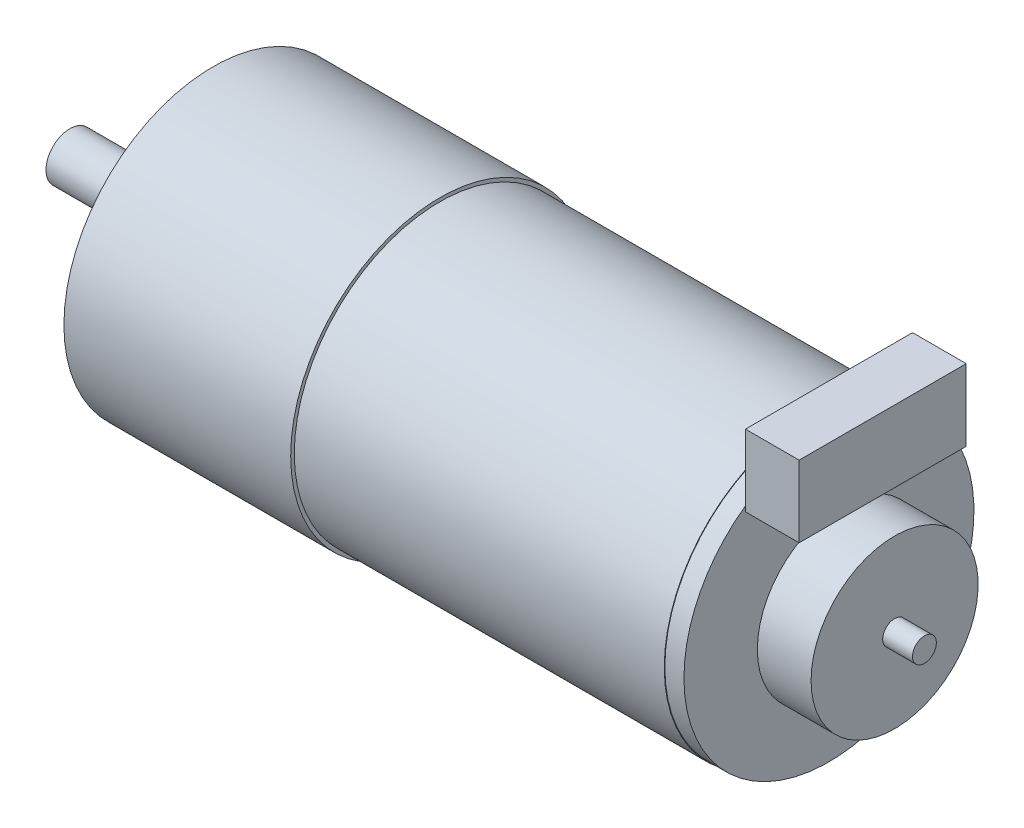
ISO-10303-21;
HEADER;
FILE_DESCRIPTION(('STEP AP214'),'2;1');
FILE_NAME('part.step','',(''),(''),'','','');
FILE_SCHEMA(('AUTOMOTIVE_DESIGN { 1 0 10303 214 1 1 1 1 }'));
ENDSEC;
DATA;
#1=APPLICATION_CONTEXT('core data for automotive mechanical design processes');
#2=APPLICATION_PROTOCOL_DEFINITION('international standard','automotive_design',2000,#1);
#3=PRODUCT_CONTEXT('',#1,'mechanical');
#4=PRODUCT('Part','Part','',(#3));
#5=PRODUCT_RELATED_PRODUCT_CATEGORY('part','',(#4));
#6=PRODUCT_DEFINITION_FORMATION('','',#4);
#7=PRODUCT_DEFINITION_CONTEXT('part definition',#1,'design');
#8=PRODUCT_DEFINITION('design','',#6,#7);
#9=PRODUCT_DEFINITION_SHAPE('','',#8);
#10=(LENGTH_UNIT() NAMED_UNIT(*) SI_UNIT(.MILLI.,.METRE.));
#11=(NAMED_UNIT(*) PLANE_ANGLE_UNIT() SI_UNIT($,.RADIAN.));
#12=(NAMED_UNIT(*) SI_UNIT($,.STERADIAN.) SOLID_ANGLE_UNIT());
#13=UNCERTAINTY_MEASURE_WITH_UNIT(LENGTH_MEASURE(1.E-05),#10,'distance_accuracy_value','');
#14=(GEOMETRIC_REPRESENTATION_CONTEXT(3) GLOBAL_UNCERTAINTY_ASSIGNED_CONTEXT((#13)) GLOBAL_UNIT_ASSIGNED_CONTEXT((#10,
#11,#12)) REPRESENTATION_CONTEXT('',''));
#15=CARTESIAN_POINT('',(0.,0.,0.));
#16=DIRECTION('',(0.,0.,1.));
#17=DIRECTION('',(1.,0.,0.));
#18=AXIS2_PLACEMENT_3D('',#15,#16,#17);
#19=CARTESIAN_POINT('',(32.6,0.,0.));
#20=DIRECTION('',(-1.,0.,0.));
#21=DIRECTION('',(0.,0.,1.));
#22=AXIS2_PLACEMENT_3D('',#19,#20,#21);
#23=PLANE('',#22);
#24=CARTESIAN_POINT('',(32.6,0.,0.));
#25=DIRECTION('',(-1.,0.,0.));
#26=DIRECTION('',(0.,0.,1.));
#27=AXIS2_PLACEMENT_3D('',#24,#25,#26);
#28=CIRCLE('',#27,1.);
#29=CARTESIAN_POINT('',(32.6,0.,1.));
#30=VERTEX_POINT('',#29);
#31=EDGE_CURVE('E135',#30,#30,#28,.T.);
#32=ORIENTED_EDGE('',*,*,#31,.T.);
#33=EDGE_LOOP('',(#32));
#34=FACE_BOUND('',#33,.T.);
#35=DIRECTION('',(0.,1.,0.));
#36=VECTOR('',#35,1.);
#37=CARTESIAN_POINT('',(32.6,9.5,-7.));
#38=LINE('',#37,#36);
#39=CARTESIAN_POINT('',(32.6,9.5,-7.));
#40=VERTEX_POINT('',#39);
#41=CARTESIAN_POINT('',(32.6,9.93088616388286,-7.));
#42=VERTEX_POINT('',#41);
#43=EDGE_CURVE('E518',#40,#42,#38,.T.);
#44=ORIENTED_EDGE('',*,*,#43,.F.);
#45=DIRECTION('',(0.,0.,-1.));
#46=VECTOR('',#45,1.);
#47=CARTESIAN_POINT('',(32.6,9.5,-7.));
#48=LINE('',#47,#46);
#49=CARTESIAN_POINT('',(32.6,9.5,7.));
#50=VERTEX_POINT('',#49);
#51=EDGE_CURVE('E54',#50,#40,#48,.T.);
#52=ORIENTED_EDGE('',*,*,#51,.F.);
#53=DIRECTION('',(0.,-1.,0.));
#54=VECTOR('',#53,1.);
#55=CARTESIAN_POINT('',(32.6,0.,7.));
#56=LINE('',#55,#54);
#57=CARTESIAN_POINT('',(32.6,9.93088616388286,7.));
#58=VERTEX_POINT('',#57);
#59=EDGE_CURVE('E11',#58,#50,#56,.T.);
#60=ORIENTED_EDGE('',*,*,#59,.F.);
#61=CARTESIAN_POINT('',(32.6,0.,0.));
#62=DIRECTION('',(-1.,0.,0.));
#63=DIRECTION('',(0.,0.,1.));
#64=AXIS2_PLACEMENT_3D('',#61,#62,#63);
#65=CIRCLE('',#64,12.15);
#66=EDGE_CURVE('E58',#42,#58,#65,.T.);
#67=ORIENTED_EDGE('',*,*,#66,.F.);
#68=EDGE_LOOP('',(#44,#52,#60,#67));
#69=FACE_BOUND('',#68,.T.);
#70=ADVANCED_FACE('F39',(#34,#69),#23,.F.);
#71=CARTESIAN_POINT('',(38.1,0.,0.));
#72=DIRECTION('',(-1.,0.,0.));
#73=DIRECTION('',(0.,0.,1.));
#74=AXIS2_PLACEMENT_3D('',#71,#72,#73);
#75=PLANE('',#74);
#76=CARTESIAN_POINT('',(38.1,0.,0.));
#77=DIRECTION('',(-1.,0.,0.));
#78=DIRECTION('',(0.,0.,1.));
#79=AXIS2_PLACEMENT_3D('',#76,#77,#78);
#80=CIRCLE('',#79,7.);
#81=CARTESIAN_POINT('',(38.1,0.,7.));
#82=VERTEX_POINT('',#81);
#83=EDGE_CURVE('E121',#82,#82,#80,.T.);
#84=ORIENTED_EDGE('',*,*,#83,.F.);
#85=EDGE_LOOP('',(#84));
#86=FACE_BOUND('',#85,.T.);
#87=CARTESIAN_POINT('',(38.1,0.,0.));
#88=DIRECTION('',(-1.,0.,0.));
#89=DIRECTION('',(0.,0.,1.));
#90=AXIS2_PLACEMENT_3D('',#87,#88,#89);
#91=CIRCLE('',#90,1.);
#92=CARTESIAN_POINT('',(38.1,0.,1.));
#93=VERTEX_POINT('',#92);
#94=EDGE_CURVE('E47',#93,#93,#91,.T.);
#95=ORIENTED_EDGE('',*,*,#94,.T.);
#96=EDGE_LOOP('',(#95));
#97=FACE_BOUND('',#96,.T.);
#98=ADVANCED_FACE('F41',(#86,#97),#75,.F.);
#99=CARTESIAN_POINT('',(-48.7692223107347,0.,0.));
#100=DIRECTION('',(-1.,0.,0.));
#101=DIRECTION('',(0.,0.,1.));
#102=AXIS2_PLACEMENT_3D('',#99,#100,#101);
#103=CYLINDRICAL_SURFACE('',#102,1.);
#104=CARTESIAN_POINT('',(40.6,0.,0.));
#105=DIRECTION('',(-1.,0.,0.));
#106=DIRECTION('',(0.,0.,1.));
#107=AXIS2_PLACEMENT_3D('',#104,#105,#106);
#108=CIRCLE('',#107,1.);
#109=CARTESIAN_POINT('',(40.6,0.,1.));
#110=VERTEX_POINT('',#109);
#111=EDGE_CURVE('E167',#110,#110,#108,.T.);
#112=ORIENTED_EDGE('',*,*,#111,.T.);
#113=EDGE_LOOP('',(#112));
#114=FACE_BOUND('',#113,.T.);
#115=ORIENTED_EDGE('',*,*,#94,.F.);
#116=EDGE_LOOP('',(#115));
#117=FACE_BOUND('',#116,.T.);
#118=ADVANCED_FACE('F173',(#114,#117),#103,.T.);
#119=CARTESIAN_POINT('',(40.6,0.,0.));
#120=DIRECTION('',(-1.,0.,0.));
#121=DIRECTION('',(0.,0.,1.));
#122=AXIS2_PLACEMENT_3D('',#119,#120,#121);
#123=PLANE('',#122);
#124=ORIENTED_EDGE('',*,*,#111,.F.);
#125=EDGE_LOOP('',(#124));
#126=FACE_BOUND('',#125,.T.);
#127=ADVANCED_FACE('F175',(#126),#123,.F.);
#128=CARTESIAN_POINT('',(-31.,0.,0.));
#129=DIRECTION('',(-1.,0.,0.));
#130=DIRECTION('',(0.,0.,1.));
#131=AXIS2_PLACEMENT_3D('',#128,#129,#130);
#132=PLANE('',#131);
#133=CARTESIAN_POINT('',(-31.,0.,0.));
#134=DIRECTION('',(-1.,0.,0.));
#135=DIRECTION('',(0.,0.,1.));
#136=AXIS2_PLACEMENT_3D('',#133,#134,#135);
#137=CIRCLE('',#136,2.);
#138=CARTESIAN_POINT('',(-31.,0.,2.));
#139=VERTEX_POINT('',#138);
#140=EDGE_CURVE('E164',#139,#139,#137,.T.);
#141=ORIENTED_EDGE('',*,*,#140,.T.);
#142=EDGE_LOOP('',(#141));
#143=FACE_BOUND('',#142,.T.);
#144=ADVANCED_FACE('F181',(#143),#132,.T.);
#145=CARTESIAN_POINT('',(-48.7692223107347,0.,0.));
#146=DIRECTION('',(-1.,0.,0.));
#147=DIRECTION('',(0.,0.,1.));
#148=AXIS2_PLACEMENT_3D('',#145,#146,#147);
#149=CYLINDRICAL_SURFACE('',#148,2.);
#150=ORIENTED_EDGE('',*,*,#140,.F.);
#151=EDGE_LOOP('',(#150));
#152=FACE_BOUND('',#151,.T.);
#153=CARTESIAN_POINT('',(-21.5,0.,0.));
#154=DIRECTION('',(-1.,0.,0.));
#155=DIRECTION('',(0.,0.,1.));
#156=AXIS2_PLACEMENT_3D('',#153,#154,#155);
#157=CIRCLE('',#156,2.);
#158=CARTESIAN_POINT('',(-21.5,0.,2.));
#159=VERTEX_POINT('',#158);
#160=EDGE_CURVE('E161',#159,#159,#157,.T.);
#161=ORIENTED_EDGE('',*,*,#160,.T.);
#162=EDGE_LOOP('',(#161));
#163=FACE_BOUND('',#162,.T.);
#164=ADVANCED_FACE('F225',(#152,#163),#149,.T.);
#165=CARTESIAN_POINT('',(-21.5,0.,0.));
#166=DIRECTION('',(-1.,0.,0.));
#167=DIRECTION('',(0.,0.,1.));
#168=AXIS2_PLACEMENT_3D('',#165,#166,#167);
#169=PLANE('',#168);
#170=CARTESIAN_POINT('',(-21.5,0.,0.));
#171=DIRECTION('',(-1.,0.,0.));
#172=DIRECTION('',(0.,0.,1.));
#173=AXIS2_PLACEMENT_3D('',#170,#171,#172);
#174=CIRCLE('',#173,3.5);
#175=CARTESIAN_POINT('',(-21.5,0.,3.5));
#176=VERTEX_POINT('',#175);
#177=EDGE_CURVE('E158',#176,#176,#174,.T.);
#178=ORIENTED_EDGE('',*,*,#177,.T.);
#179=EDGE_LOOP('',(#178));
#180=FACE_BOUND('',#179,.T.);
#181=ORIENTED_EDGE('',*,*,#160,.F.);
#182=EDGE_LOOP('',(#181));
#183=FACE_BOUND('',#182,.T.);
#184=ADVANCED_FACE('F221',(#180,#183),#169,.T.);
#185=CARTESIAN_POINT('',(-48.7692223107347,0.,0.));
#186=DIRECTION('',(-1.,0.,0.));
#187=DIRECTION('',(0.,0.,1.));
#188=AXIS2_PLACEMENT_3D('',#185,#186,#187);
#189=CYLINDRICAL_SURFACE('',#188,3.5);
#190=ORIENTED_EDGE('',*,*,#177,.F.);
#191=EDGE_LOOP('',(#190));
#192=FACE_BOUND('',#191,.T.);
#193=CARTESIAN_POINT('',(-19.,0.,0.));
#194=DIRECTION('',(-1.,0.,0.));
#195=DIRECTION('',(0.,0.,1.));
#196=AXIS2_PLACEMENT_3D('',#193,#194,#195);
#197=CIRCLE('',#196,3.5);
#198=CARTESIAN_POINT('',(-19.,0.,3.5));
#199=VERTEX_POINT('',#198);
#200=EDGE_CURVE('E155',#199,#199,#197,.T.);
#201=ORIENTED_EDGE('',*,*,#200,.T.);
#202=EDGE_LOOP('',(#201));
#203=FACE_BOUND('',#202,.T.);
#204=ADVANCED_FACE('F217',(#192,#203),#189,.T.);
#205=CARTESIAN_POINT('',(-19.,0.,0.));
#206=DIRECTION('',(-1.,0.,0.));
#207=DIRECTION('',(0.,0.,1.));
#208=AXIS2_PLACEMENT_3D('',#205,#206,#207);
#209=PLANE('',#208);
#210=CARTESIAN_POINT('',(-19.,8.5,0.));
#211=DIRECTION('',(-1.,0.,0.));
#212=DIRECTION('',(0.,0.,1.));
#213=AXIS2_PLACEMENT_3D('',#210,#211,#212);
#214=CIRCLE('',#213,1.5);
#215=CARTESIAN_POINT('',(-19.,8.5,1.5));
#216=VERTEX_POINT('',#215);
#217=EDGE_CURVE('E122',#216,#216,#214,.T.);
#218=ORIENTED_EDGE('',*,*,#217,.F.);
#219=EDGE_LOOP('',(#218));
#220=FACE_BOUND('',#219,.T.);
#221=CARTESIAN_POINT('',(-19.,-8.5,0.));
#222=DIRECTION('',(-1.,0.,0.));
#223=DIRECTION('',(0.,0.,1.));
#224=AXIS2_PLACEMENT_3D('',#221,#222,#223);
#225=CIRCLE('',#224,1.5);
#226=CARTESIAN_POINT('',(-19.,-8.5,1.5));
#227=VERTEX_POINT('',#226);
#228=EDGE_CURVE('E112',#227,#227,#225,.T.);
#229=ORIENTED_EDGE('',*,*,#228,.F.);
#230=EDGE_LOOP('',(#229));
#231=FACE_BOUND('',#230,.T.);
#232=CARTESIAN_POINT('',(-19.,0.,0.));
#233=DIRECTION('',(-1.,0.,0.));
#234=DIRECTION('',(0.,0.,1.));
#235=AXIS2_PLACEMENT_3D('',#232,#233,#234);
#236=CIRCLE('',#235,12.5);
#237=CARTESIAN_POINT('',(-19.,0.,12.5));
#238=VERTEX_POINT('',#237);
#239=EDGE_CURVE('E152',#238,#238,#236,.T.);
#240=ORIENTED_EDGE('',*,*,#239,.T.);
#241=EDGE_LOOP('',(#240));
#242=FACE_BOUND('',#241,.T.);
#243=ORIENTED_EDGE('',*,*,#200,.F.);
#244=EDGE_LOOP('',(#243));
#245=FACE_BOUND('',#244,.T.);
#246=ADVANCED_FACE('F213',(#220,#231,#242,#245),#209,.T.);
#247=CARTESIAN_POINT('',(-48.7692223107347,0.,0.));
#248=DIRECTION('',(-1.,0.,0.));
#249=DIRECTION('',(0.,0.,1.));
#250=AXIS2_PLACEMENT_3D('',#247,#248,#249);
#251=CYLINDRICAL_SURFACE('',#250,12.5);
#252=ORIENTED_EDGE('',*,*,#239,.F.);
#253=EDGE_LOOP('',(#252));
#254=FACE_BOUND('',#253,.T.);
#255=CARTESIAN_POINT('',(0.,0.,0.));
#256=DIRECTION('',(-1.,0.,0.));
#257=DIRECTION('',(0.,0.,1.));
#258=AXIS2_PLACEMENT_3D('',#255,#256,#257);
#259=CIRCLE('',#258,12.5);
#260=CARTESIAN_POINT('',(0.,0.,12.5));
#261=VERTEX_POINT('',#260);
#262=EDGE_CURVE('E149',#261,#261,#259,.T.);
#263=ORIENTED_EDGE('',*,*,#262,.T.);
#264=EDGE_LOOP('',(#263));
#265=FACE_BOUND('',#264,.T.);
#266=ADVANCED_FACE('F209',(#254,#265),#251,.T.);
#267=CARTESIAN_POINT('',(0.,0.,0.));
#268=DIRECTION('',(-1.,0.,0.));
#269=DIRECTION('',(0.,0.,1.));
#270=AXIS2_PLACEMENT_3D('',#267,#268,#269);
#271=PLANE('',#270);
#272=ORIENTED_EDGE('',*,*,#262,.F.);
#273=EDGE_LOOP('',(#272));
#274=FACE_BOUND('',#273,.T.);
#275=CARTESIAN_POINT('',(0.,0.,0.));
#276=DIRECTION('',(-1.,0.,0.));
#277=DIRECTION('',(0.,0.,1.));
#278=AXIS2_PLACEMENT_3D('',#275,#276,#277);
#279=CIRCLE('',#278,12.2);
#280=CARTESIAN_POINT('',(0.,0.,12.2));
#281=VERTEX_POINT('',#280);
#282=EDGE_CURVE('E146',#281,#281,#279,.T.);
#283=ORIENTED_EDGE('',*,*,#282,.T.);
#284=EDGE_LOOP('',(#283));
#285=FACE_BOUND('',#284,.T.);
#286=ADVANCED_FACE('F205',(#274,#285),#271,.F.);
#287=CARTESIAN_POINT('',(-48.7692223107347,0.,0.));
#288=DIRECTION('',(-1.,0.,0.));
#289=DIRECTION('',(0.,0.,1.));
#290=AXIS2_PLACEMENT_3D('',#287,#288,#289);
#291=CYLINDRICAL_SURFACE('',#290,12.2);
#292=CARTESIAN_POINT('',(31.,0.,0.));
#293=DIRECTION('',(-1.,0.,0.));
#294=DIRECTION('',(0.,0.,1.));
#295=AXIS2_PLACEMENT_3D('',#292,#293,#294);
#296=CIRCLE('',#295,12.2);
#297=CARTESIAN_POINT('',(31.,0.,12.2));
#298=VERTEX_POINT('',#297);
#299=EDGE_CURVE('E143',#298,#298,#296,.T.);
#300=ORIENTED_EDGE('',*,*,#299,.T.);
#301=EDGE_LOOP('',(#300));
#302=FACE_BOUND('',#301,.T.);
#303=ORIENTED_EDGE('',*,*,#282,.F.);
#304=EDGE_LOOP('',(#303));
#305=FACE_BOUND('',#304,.T.);
#306=ADVANCED_FACE('F201',(#302,#305),#291,.T.);
#307=CARTESIAN_POINT('',(31.,0.,0.));
#308=DIRECTION('',(-1.,0.,0.));
#309=DIRECTION('',(0.,0.,1.));
#310=AXIS2_PLACEMENT_3D('',#307,#308,#309);
#311=PLANE('',#310);
#312=ORIENTED_EDGE('',*,*,#299,.F.);
#313=EDGE_LOOP('',(#312));
#314=FACE_BOUND('',#313,.T.);
#315=CARTESIAN_POINT('',(31.,0.,0.));
#316=DIRECTION('',(-1.,0.,0.));
#317=DIRECTION('',(0.,0.,1.));
#318=AXIS2_PLACEMENT_3D('',#315,#316,#317);
#319=CIRCLE('',#318,12.15);
#320=CARTESIAN_POINT('',(31.,0.,12.15));
#321=VERTEX_POINT('',#320);
#322=EDGE_CURVE('E140',#321,#321,#319,.T.);
#323=ORIENTED_EDGE('',*,*,#322,.T.);
#324=EDGE_LOOP('',(#323));
#325=FACE_BOUND('',#324,.T.);
#326=ADVANCED_FACE('F197',(#314,#325),#311,.F.);
#327=CARTESIAN_POINT('',(-48.7692223107347,0.,0.));
#328=DIRECTION('',(-1.,0.,0.));
#329=DIRECTION('',(0.,0.,1.));
#330=AXIS2_PLACEMENT_3D('',#327,#328,#329);
#331=CYLINDRICAL_SURFACE('',#330,12.15);
#332=EDGE_CURVE('E138',#58,#42,#65,.T.);
#333=ORIENTED_EDGE('',*,*,#332,.T.);
#334=ORIENTED_EDGE('',*,*,#66,.T.);
#335=EDGE_LOOP('',(#333,#334));
#336=FACE_BOUND('',#335,.T.);
#337=ORIENTED_EDGE('',*,*,#322,.F.);
#338=EDGE_LOOP('',(#337));
#339=FACE_BOUND('',#338,.T.);
#340=ADVANCED_FACE('F194',(#336,#339),#331,.T.);
#341=CARTESIAN_POINT('',(-48.7692223107347,0.,0.));
#342=DIRECTION('',(-1.,0.,0.));
#343=DIRECTION('',(0.,0.,1.));
#344=AXIS2_PLACEMENT_3D('',#341,#342,#343);
#345=CYLINDRICAL_SURFACE('',#344,1.);
#346=ORIENTED_EDGE('',*,*,#31,.F.);
#347=EDGE_LOOP('',(#346));
#348=FACE_BOUND('',#347,.T.);
#349=CARTESIAN_POINT('',(33.6,0.,0.));
#350=DIRECTION('',(-1.,0.,0.));
#351=DIRECTION('',(0.,0.,1.));
#352=AXIS2_PLACEMENT_3D('',#349,#350,#351);
#353=CIRCLE('',#352,1.);
#354=CARTESIAN_POINT('',(33.6,0.,1.));
#355=VERTEX_POINT('',#354);
#356=EDGE_CURVE('E132',#355,#355,#353,.T.);
#357=ORIENTED_EDGE('',*,*,#356,.T.);
#358=EDGE_LOOP('',(#357));
#359=FACE_BOUND('',#358,.T.);
#360=ADVANCED_FACE('F192',(#348,#359),#345,.T.);
#361=CARTESIAN_POINT('',(33.6,0.,0.));
#362=DIRECTION('',(-1.,0.,0.));
#363=DIRECTION('',(0.,0.,1.));
#364=AXIS2_PLACEMENT_3D('',#361,#362,#363);
#365=PLANE('',#364);
#366=CARTESIAN_POINT('',(33.6,0.,0.));
#367=DIRECTION('',(-1.,0.,0.));
#368=DIRECTION('',(0.,0.,1.));
#369=AXIS2_PLACEMENT_3D('',#366,#367,#368);
#370=CIRCLE('',#369,7.);
#371=CARTESIAN_POINT('',(33.6,0.,7.));
#372=VERTEX_POINT('',#371);
#373=EDGE_CURVE('E129',#372,#372,#370,.T.);
#374=ORIENTED_EDGE('',*,*,#373,.T.);
#375=EDGE_LOOP('',(#374));
#376=FACE_BOUND('',#375,.T.);
#377=ORIENTED_EDGE('',*,*,#356,.F.);
#378=EDGE_LOOP('',(#377));
#379=FACE_BOUND('',#378,.T.);
#380=ADVANCED_FACE('F285',(#376,#379),#365,.T.);
#381=CARTESIAN_POINT('',(-48.7692223107347,0.,0.));
#382=DIRECTION('',(-1.,0.,0.));
#383=DIRECTION('',(0.,0.,1.));
#384=AXIS2_PLACEMENT_3D('',#381,#382,#383);
#385=CYLINDRICAL_SURFACE('',#384,7.);
#386=ORIENTED_EDGE('',*,*,#83,.T.);
#387=EDGE_LOOP('',(#386));
#388=FACE_BOUND('',#387,.T.);
#389=ORIENTED_EDGE('',*,*,#373,.F.);
#390=EDGE_LOOP('',(#389));
#391=FACE_BOUND('',#390,.T.);
#392=ADVANCED_FACE('F292',(#388,#391),#385,.T.);
#393=CARTESIAN_POINT('',(-14.,-8.5,0.));
#394=DIRECTION('',(-1.,0.,0.));
#395=DIRECTION('',(0.,0.,1.));
#396=AXIS2_PLACEMENT_3D('',#393,#394,#395);
#397=CYLINDRICAL_SURFACE('',#396,1.5);
#398=CARTESIAN_POINT('',(-14.,-8.5,0.));
#399=DIRECTION('',(-1.,0.,0.));
#400=DIRECTION('',(0.,0.,1.));
#401=AXIS2_PLACEMENT_3D('',#398,#399,#400);
#402=CIRCLE('',#401,1.5);
#403=CARTESIAN_POINT('',(-14.,-8.5,1.5));
#404=VERTEX_POINT('',#403);
#405=EDGE_CURVE('E109',#404,#404,#402,.T.);
#406=ORIENTED_EDGE('',*,*,#405,.F.);
#407=EDGE_LOOP('',(#406));
#408=FACE_BOUND('',#407,.T.);
#409=ORIENTED_EDGE('',*,*,#228,.T.);
#410=EDGE_LOOP('',(#409));
#411=FACE_BOUND('',#410,.T.);
#412=ADVANCED_FACE('F298',(#408,#411),#397,.F.);
#413=CARTESIAN_POINT('',(-14.,-8.5,0.));
#414=DIRECTION('',(-1.,0.,0.));
#415=DIRECTION('',(0.,0.,1.));
#416=AXIS2_PLACEMENT_3D('',#413,#414,#415);
#417=PLANE('',#416);
#418=ORIENTED_EDGE('',*,*,#405,.T.);
#419=EDGE_LOOP('',(#418));
#420=FACE_BOUND('',#419,.T.);
#421=ADVANCED_FACE('F305',(#420),#417,.T.);
#422=CARTESIAN_POINT('',(-14.,8.5,0.));
#423=DIRECTION('',(-1.,0.,0.));
#424=DIRECTION('',(0.,0.,1.));
#425=AXIS2_PLACEMENT_3D('',#422,#423,#424);
#426=CYLINDRICAL_SURFACE('',#425,1.5);
#427=CARTESIAN_POINT('',(-14.,8.5,0.));
#428=DIRECTION('',(-1.,0.,0.));
#429=DIRECTION('',(0.,0.,1.));
#430=AXIS2_PLACEMENT_3D('',#427,#428,#429);
#431=CIRCLE('',#430,1.5);
#432=CARTESIAN_POINT('',(-14.,8.5,1.5));
#433=VERTEX_POINT('',#432);
#434=EDGE_CURVE('E118',#433,#433,#431,.T.);
#435=ORIENTED_EDGE('',*,*,#434,.F.);
#436=EDGE_LOOP('',(#435));
#437=FACE_BOUND('',#436,.T.);
#438=ORIENTED_EDGE('',*,*,#217,.T.);
#439=EDGE_LOOP('',(#438));
#440=FACE_BOUND('',#439,.T.);
#441=ADVANCED_FACE('F313',(#437,#440),#426,.F.);
#442=CARTESIAN_POINT('',(-14.,8.5,0.));
#443=DIRECTION('',(-1.,0.,0.));
#444=DIRECTION('',(0.,0.,1.));
#445=AXIS2_PLACEMENT_3D('',#442,#443,#444);
#446=PLANE('',#445);
#447=ORIENTED_EDGE('',*,*,#434,.T.);
#448=EDGE_LOOP('',(#447));
#449=FACE_BOUND('',#448,.T.);
#450=ADVANCED_FACE('F321',(#449),#446,.T.);
#451=CARTESIAN_POINT('',(37.1,9.5,-7.));
#452=DIRECTION('',(0.,0.,1.));
#453=DIRECTION('',(0.,-1.,0.));
#454=AXIS2_PLACEMENT_3D('',#451,#452,#453);
#455=PLANE('',#454);
#456=ORIENTED_EDGE('',*,*,#43,.T.);
#457=CARTESIAN_POINT('',(32.6,15.5,-7.));
#458=VERTEX_POINT('',#457);
#459=EDGE_CURVE('E107',#42,#458,#38,.T.);
#460=ORIENTED_EDGE('',*,*,#459,.T.);
#461=DIRECTION('',(-1.,0.,0.));
#462=VECTOR('',#461,1.);
#463=CARTESIAN_POINT('',(37.1,15.5,-7.));
#464=LINE('',#463,#462);
#465=CARTESIAN_POINT('',(37.1,15.5,-7.));
#466=VERTEX_POINT('',#465);
#467=EDGE_CURVE('E88',#466,#458,#464,.T.);
#468=ORIENTED_EDGE('',*,*,#467,.F.);
#469=DIRECTION('',(0.,1.,0.));
#470=VECTOR('',#469,1.);
#471=CARTESIAN_POINT('',(37.1,9.5,-7.));
#472=LINE('',#471,#470);
#473=CARTESIAN_POINT('',(37.1,9.5,-7.));
#474=VERTEX_POINT('',#473);
#475=EDGE_CURVE('E94',#474,#466,#472,.T.);
#476=ORIENTED_EDGE('',*,*,#475,.F.);
#477=DIRECTION('',(-1.,0.,0.));
#478=VECTOR('',#477,1.);
#479=CARTESIAN_POINT('',(37.1,9.5,-7.));
#480=LINE('',#479,#478);
#481=EDGE_CURVE('E522',#474,#40,#480,.T.);
#482=ORIENTED_EDGE('',*,*,#481,.T.);
#483=EDGE_LOOP('',(#456,#460,#468,#476,#482));
#484=FACE_BOUND('',#483,.T.);
#485=ADVANCED_FACE('F105',(#484),#455,.F.);
#486=CARTESIAN_POINT('',(37.1,15.5,-7.));
#487=DIRECTION('',(0.,-1.,0.));
#488=DIRECTION('',(0.,0.,-1.));
#489=AXIS2_PLACEMENT_3D('',#486,#487,#488);
#490=PLANE('',#489);
#491=DIRECTION('',(0.,0.,1.));
#492=VECTOR('',#491,1.);
#493=CARTESIAN_POINT('',(32.6,15.5,-7.));
#494=LINE('',#493,#492);
#495=CARTESIAN_POINT('',(32.6,15.5,7.));
#496=VERTEX_POINT('',#495);
#497=EDGE_CURVE('E515',#458,#496,#494,.T.);
#498=ORIENTED_EDGE('',*,*,#497,.T.);
#499=DIRECTION('',(-1.,0.,0.));
#500=VECTOR('',#499,1.);
#501=CARTESIAN_POINT('',(37.1,15.5,7.));
#502=LINE('',#501,#500);
#503=CARTESIAN_POINT('',(37.1,15.5,7.));
#504=VERTEX_POINT('',#503);
#505=EDGE_CURVE('E90',#504,#496,#502,.T.);
#506=ORIENTED_EDGE('',*,*,#505,.F.);
#507=DIRECTION('',(0.,0.,1.));
#508=VECTOR('',#507,1.);
#509=CARTESIAN_POINT('',(37.1,15.5,-7.));
#510=LINE('',#509,#508);
#511=EDGE_CURVE('E84',#466,#504,#510,.T.);
#512=ORIENTED_EDGE('',*,*,#511,.F.);
#513=ORIENTED_EDGE('',*,*,#467,.T.);
#514=EDGE_LOOP('',(#498,#506,#512,#513));
#515=FACE_BOUND('',#514,.T.);
#516=ADVANCED_FACE('F86',(#515),#490,.F.);
#517=CARTESIAN_POINT('',(37.1,9.5,7.));
#518=DIRECTION('',(0.,0.,-1.));
#519=DIRECTION('',(-1.,0.,0.));
#520=AXIS2_PLACEMENT_3D('',#517,#518,#519);
#521=PLANE('',#520);
#522=DIRECTION('',(0.,-1.,0.));
#523=VECTOR('',#522,1.);
#524=CARTESIAN_POINT('',(32.6,9.5,7.));
#525=LINE('',#524,#523);
#526=EDGE_CURVE('E512',#496,#58,#525,.T.);
#527=ORIENTED_EDGE('',*,*,#526,.T.);
#528=ORIENTED_EDGE('',*,*,#59,.T.);
#529=DIRECTION('',(-1.,0.,0.));
#530=VECTOR('',#529,1.);
#531=CARTESIAN_POINT('',(37.1,9.5,7.));
#532=LINE('',#531,#530);
#533=CARTESIAN_POINT('',(37.1,9.5,7.));
#534=VERTEX_POINT('',#533);
#535=EDGE_CURVE('E114',#534,#50,#532,.T.);
#536=ORIENTED_EDGE('',*,*,#535,.F.);
#537=DIRECTION('',(0.,-1.,0.));
#538=VECTOR('',#537,1.);
#539=CARTESIAN_POINT('',(37.1,9.5,7.));
#540=LINE('',#539,#538);
#541=EDGE_CURVE('E93',#504,#534,#540,.T.);
#542=ORIENTED_EDGE('',*,*,#541,.F.);
#543=ORIENTED_EDGE('',*,*,#505,.T.);
#544=EDGE_LOOP('',(#527,#528,#536,#542,#543));
#545=FACE_BOUND('',#544,.T.);
#546=ADVANCED_FACE('F341',(#545),#521,.F.);
#547=CARTESIAN_POINT('',(37.1,9.5,-7.));
#548=DIRECTION('',(0.,1.,0.));
#549=DIRECTION('',(0.,0.,1.));
#550=AXIS2_PLACEMENT_3D('',#547,#548,#549);
#551=PLANE('',#550);
#552=ORIENTED_EDGE('',*,*,#51,.T.);
#553=ORIENTED_EDGE('',*,*,#481,.F.);
#554=DIRECTION('',(0.,0.,-1.));
#555=VECTOR('',#554,1.);
#556=CARTESIAN_POINT('',(37.1,9.5,-7.));
#557=LINE('',#556,#555);
#558=EDGE_CURVE('E99',#534,#474,#557,.T.);
#559=ORIENTED_EDGE('',*,*,#558,.F.);
#560=ORIENTED_EDGE('',*,*,#535,.T.);
#561=EDGE_LOOP('',(#552,#553,#559,#560));
#562=FACE_BOUND('',#561,.T.);
#563=ADVANCED_FACE('F348',(#562),#551,.F.);
#564=CARTESIAN_POINT('',(37.1,0.,0.));
#565=DIRECTION('',(1.,0.,0.));
#566=DIRECTION('',(0.,0.,-1.));
#567=AXIS2_PLACEMENT_3D('',#564,#565,#566);
#568=PLANE('',#567);
#569=ORIENTED_EDGE('',*,*,#475,.T.);
#570=ORIENTED_EDGE('',*,*,#511,.T.);
#571=ORIENTED_EDGE('',*,*,#541,.T.);
#572=ORIENTED_EDGE('',*,*,#558,.T.);
#573=EDGE_LOOP('',(#569,#570,#571,#572));
#574=FACE_BOUND('',#573,.T.);
#575=ADVANCED_FACE('F97',(#574),#568,.T.);
#576=CARTESIAN_POINT('',(32.6,0.,0.));
#577=DIRECTION('',(1.,0.,0.));
#578=DIRECTION('',(0.,0.,-1.));
#579=AXIS2_PLACEMENT_3D('',#576,#577,#578);
#580=PLANE('',#579);
#581=ORIENTED_EDGE('',*,*,#332,.F.);
#582=ORIENTED_EDGE('',*,*,#526,.F.);
#583=ORIENTED_EDGE('',*,*,#497,.F.);
#584=ORIENTED_EDGE('',*,*,#459,.F.);
#585=EDGE_LOOP('',(#581,#582,#583,#584));
#586=FACE_BOUND('',#585,.T.);
#587=ADVANCED_FACE('F363',(#586),#580,.F.);
#588=CLOSED_SHELL('',(#70,#98,#118,#127,#144,#164,#184,#204,#246,#266,#286,#306,#326,#340,#360,
#380,#392,#412,#421,#441,#450,#485,#516,#546,#563,#575,#587));
#589=MANIFOLD_SOLID_BREP('B2',#588);
#590=ADVANCED_BREP_SHAPE_REPRESENTATION('',(#18,#589),#14);
#591=SHAPE_DEFINITION_REPRESENTATION(#9,#590);
ENDSEC;
END-ISO-10303-21;
